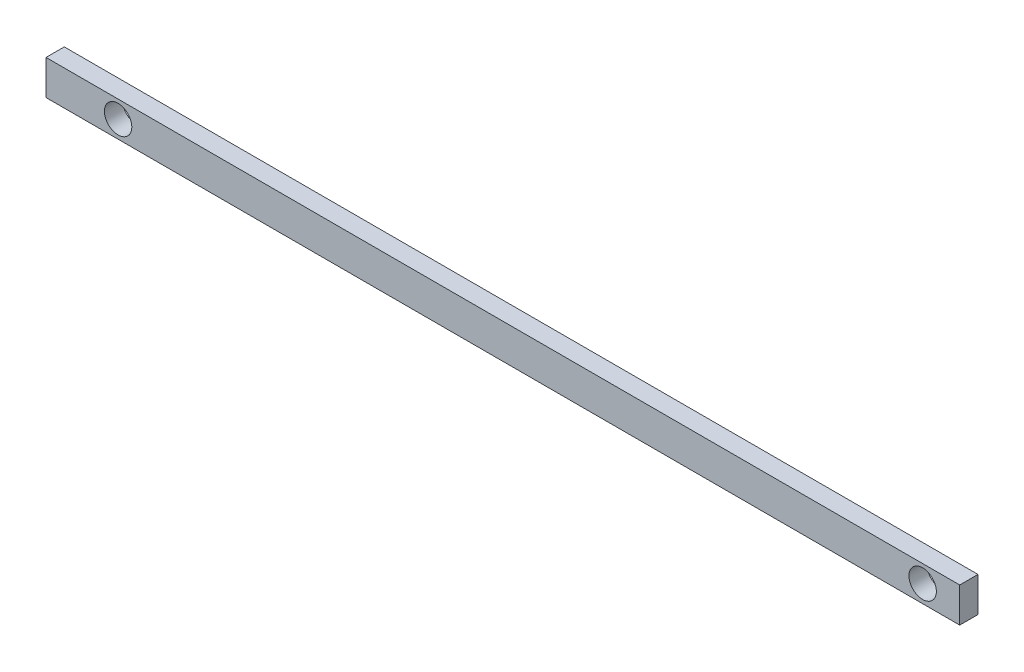
ISO-10303-21;
HEADER;
FILE_DESCRIPTION(('STEP AP214'),'2;1');
FILE_NAME('part.step','',(''),(''),'','','');
FILE_SCHEMA(('AUTOMOTIVE_DESIGN { 1 0 10303 214 1 1 1 1 }'));
ENDSEC;
DATA;
#1=APPLICATION_CONTEXT('core data for automotive mechanical design processes');
#2=APPLICATION_PROTOCOL_DEFINITION('international standard','automotive_design',2000,#1);
#3=PRODUCT_CONTEXT('',#1,'mechanical');
#4=PRODUCT('Part','Part','',(#3));
#5=PRODUCT_RELATED_PRODUCT_CATEGORY('part','',(#4));
#6=PRODUCT_DEFINITION_FORMATION('','',#4);
#7=PRODUCT_DEFINITION_CONTEXT('part definition',#1,'design');
#8=PRODUCT_DEFINITION('design','',#6,#7);
#9=PRODUCT_DEFINITION_SHAPE('','',#8);
#10=(LENGTH_UNIT() NAMED_UNIT(*) SI_UNIT(.MILLI.,.METRE.));
#11=(NAMED_UNIT(*) PLANE_ANGLE_UNIT() SI_UNIT($,.RADIAN.));
#12=(NAMED_UNIT(*) SI_UNIT($,.STERADIAN.) SOLID_ANGLE_UNIT());
#13=UNCERTAINTY_MEASURE_WITH_UNIT(LENGTH_MEASURE(1.E-05),#10,'distance_accuracy_value','');
#14=(GEOMETRIC_REPRESENTATION_CONTEXT(3) GLOBAL_UNCERTAINTY_ASSIGNED_CONTEXT((#13)) GLOBAL_UNIT_ASSIGNED_CONTEXT((#10,
#11,#12)) REPRESENTATION_CONTEXT('',''));
#15=CARTESIAN_POINT('',(0.,0.,0.));
#16=DIRECTION('',(0.,0.,1.));
#17=DIRECTION('',(1.,0.,0.));
#18=AXIS2_PLACEMENT_3D('',#15,#16,#17);
#19=CARTESIAN_POINT('',(0.,0.,10.));
#20=DIRECTION('',(0.,0.,1.));
#21=DIRECTION('',(1.,0.,0.));
#22=AXIS2_PLACEMENT_3D('',#19,#20,#21);
#23=PLANE('',#22);
#24=CARTESIAN_POINT('',(-210.549507460908,0.,10.));
#25=DIRECTION('',(0.,0.,1.));
#26=DIRECTION('',(1.,0.,0.));
#27=AXIS2_PLACEMENT_3D('',#24,#25,#26);
#28=CIRCLE('',#27,7.50000000000001);
#29=CARTESIAN_POINT('',(-203.049507460908,0.,10.));
#30=VERTEX_POINT('',#29);
#31=EDGE_CURVE('E112',#30,#30,#28,.T.);
#32=ORIENTED_EDGE('',*,*,#31,.F.);
#33=EDGE_LOOP('',(#32));
#34=FACE_BOUND('',#33,.T.);
#35=DIRECTION('',(0.,1.,0.));
#36=VECTOR('',#35,1.);
#37=CARTESIAN_POINT('',(250.,9.51776649746193,10.));
#38=LINE('',#37,#36);
#39=CARTESIAN_POINT('',(250.,-9.51776649746193,10.));
#40=VERTEX_POINT('',#39);
#41=CARTESIAN_POINT('',(250.,9.51776649746193,10.));
#42=VERTEX_POINT('',#41);
#43=EDGE_CURVE('E92',#40,#42,#38,.T.);
#44=ORIENTED_EDGE('',*,*,#43,.T.);
#45=DIRECTION('',(-1.,0.,0.));
#46=VECTOR('',#45,1.);
#47=CARTESIAN_POINT('',(-250.,9.51776649746193,10.));
#48=LINE('',#47,#46);
#49=CARTESIAN_POINT('',(-250.,9.51776649746193,10.));
#50=VERTEX_POINT('',#49);
#51=EDGE_CURVE('E87',#42,#50,#48,.T.);
#52=ORIENTED_EDGE('',*,*,#51,.T.);
#53=DIRECTION('',(0.,-1.,0.));
#54=VECTOR('',#53,1.);
#55=CARTESIAN_POINT('',(-250.,9.51776649746193,10.));
#56=LINE('',#55,#54);
#57=CARTESIAN_POINT('',(-250.,-9.51776649746193,10.));
#58=VERTEX_POINT('',#57);
#59=EDGE_CURVE('E90',#50,#58,#56,.T.);
#60=ORIENTED_EDGE('',*,*,#59,.T.);
#61=DIRECTION('',(1.,0.,0.));
#62=VECTOR('',#61,1.);
#63=CARTESIAN_POINT('',(-250.,-9.51776649746193,10.));
#64=LINE('',#63,#62);
#65=EDGE_CURVE('E57',#58,#40,#64,.T.);
#66=ORIENTED_EDGE('',*,*,#65,.T.);
#67=EDGE_LOOP('',(#44,#52,#60,#66));
#68=FACE_BOUND('',#67,.T.);
#69=CARTESIAN_POINT('',(229.708492539092,0.,10.));
#70=DIRECTION('',(0.,0.,1.));
#71=DIRECTION('',(1.,0.,0.));
#72=AXIS2_PLACEMENT_3D('',#69,#70,#71);
#73=CIRCLE('',#72,7.50000000000001);
#74=CARTESIAN_POINT('',(237.208492539092,0.,10.));
#75=VERTEX_POINT('',#74);
#76=EDGE_CURVE('E134',#75,#75,#73,.T.);
#77=ORIENTED_EDGE('',*,*,#76,.F.);
#78=EDGE_LOOP('',(#77));
#79=FACE_BOUND('',#78,.T.);
#80=ADVANCED_FACE('F39',(#34,#68,#79),#23,.T.);
#81=CARTESIAN_POINT('',(0.,0.,0.));
#82=DIRECTION('',(0.,0.,1.));
#83=DIRECTION('',(1.,0.,0.));
#84=AXIS2_PLACEMENT_3D('',#81,#82,#83);
#85=PLANE('',#84);
#86=DIRECTION('',(0.,1.,0.));
#87=VECTOR('',#86,1.);
#88=CARTESIAN_POINT('',(250.,9.51776649746193,0.));
#89=LINE('',#88,#87);
#90=CARTESIAN_POINT('',(250.,-9.51776649746193,0.));
#91=VERTEX_POINT('',#90);
#92=CARTESIAN_POINT('',(250.,9.51776649746193,0.));
#93=VERTEX_POINT('',#92);
#94=EDGE_CURVE('E108',#91,#93,#89,.T.);
#95=ORIENTED_EDGE('',*,*,#94,.F.);
#96=DIRECTION('',(1.,0.,0.));
#97=VECTOR('',#96,1.);
#98=CARTESIAN_POINT('',(-250.,-9.51776649746193,0.));
#99=LINE('',#98,#97);
#100=CARTESIAN_POINT('',(-250.,-9.51776649746193,0.));
#101=VERTEX_POINT('',#100);
#102=EDGE_CURVE('E80',#101,#91,#99,.T.);
#103=ORIENTED_EDGE('',*,*,#102,.F.);
#104=DIRECTION('',(0.,-1.,0.));
#105=VECTOR('',#104,1.);
#106=CARTESIAN_POINT('',(-250.,9.51776649746193,0.));
#107=LINE('',#106,#105);
#108=CARTESIAN_POINT('',(-250.,9.51776649746193,0.));
#109=VERTEX_POINT('',#108);
#110=EDGE_CURVE('E74',#109,#101,#107,.T.);
#111=ORIENTED_EDGE('',*,*,#110,.F.);
#112=DIRECTION('',(-1.,0.,0.));
#113=VECTOR('',#112,1.);
#114=CARTESIAN_POINT('',(-250.,9.51776649746193,0.));
#115=LINE('',#114,#113);
#116=EDGE_CURVE('E97',#93,#109,#115,.T.);
#117=ORIENTED_EDGE('',*,*,#116,.F.);
#118=EDGE_LOOP('',(#95,#103,#111,#117));
#119=FACE_BOUND('',#118,.T.);
#120=CARTESIAN_POINT('',(-210.549507460908,0.,0.));
#121=DIRECTION('',(0.,0.,1.));
#122=DIRECTION('',(1.,0.,0.));
#123=AXIS2_PLACEMENT_3D('',#120,#121,#122);
#124=CIRCLE('',#123,7.50000000000001);
#125=CARTESIAN_POINT('',(-203.049507460908,0.,0.));
#126=VERTEX_POINT('',#125);
#127=EDGE_CURVE('E130',#126,#126,#124,.T.);
#128=ORIENTED_EDGE('',*,*,#127,.T.);
#129=EDGE_LOOP('',(#128));
#130=FACE_BOUND('',#129,.T.);
#131=CARTESIAN_POINT('',(229.708492539092,0.,0.));
#132=DIRECTION('',(0.,0.,1.));
#133=DIRECTION('',(1.,0.,0.));
#134=AXIS2_PLACEMENT_3D('',#131,#132,#133);
#135=CIRCLE('',#134,7.50000000000001);
#136=CARTESIAN_POINT('',(237.208492539092,0.,0.));
#137=VERTEX_POINT('',#136);
#138=EDGE_CURVE('E138',#137,#137,#135,.T.);
#139=ORIENTED_EDGE('',*,*,#138,.T.);
#140=EDGE_LOOP('',(#139));
#141=FACE_BOUND('',#140,.T.);
#142=ADVANCED_FACE('F125',(#119,#130,#141),#85,.F.);
#143=CARTESIAN_POINT('',(250.,9.51776649746193,10.));
#144=DIRECTION('',(-1.,0.,0.));
#145=DIRECTION('',(0.,0.,1.));
#146=AXIS2_PLACEMENT_3D('',#143,#144,#145);
#147=PLANE('',#146);
#148=ORIENTED_EDGE('',*,*,#94,.T.);
#149=DIRECTION('',(0.,0.,-1.));
#150=VECTOR('',#149,1.);
#151=CARTESIAN_POINT('',(250.,9.51776649746193,10.));
#152=LINE('',#151,#150);
#153=EDGE_CURVE('E11',#42,#93,#152,.T.);
#154=ORIENTED_EDGE('',*,*,#153,.F.);
#155=ORIENTED_EDGE('',*,*,#43,.F.);
#156=DIRECTION('',(0.,0.,-1.));
#157=VECTOR('',#156,1.);
#158=CARTESIAN_POINT('',(250.,-9.51776649746193,10.));
#159=LINE('',#158,#157);
#160=EDGE_CURVE('E104',#40,#91,#159,.T.);
#161=ORIENTED_EDGE('',*,*,#160,.T.);
#162=EDGE_LOOP('',(#148,#154,#155,#161));
#163=FACE_BOUND('',#162,.T.);
#164=ADVANCED_FACE('F41',(#163),#147,.F.);
#165=CARTESIAN_POINT('',(-250.,9.51776649746193,10.));
#166=DIRECTION('',(0.,-1.,0.));
#167=DIRECTION('',(0.,0.,-1.));
#168=AXIS2_PLACEMENT_3D('',#165,#166,#167);
#169=PLANE('',#168);
#170=ORIENTED_EDGE('',*,*,#116,.T.);
#171=DIRECTION('',(0.,0.,-1.));
#172=VECTOR('',#171,1.);
#173=CARTESIAN_POINT('',(-250.,9.51776649746193,10.));
#174=LINE('',#173,#172);
#175=EDGE_CURVE('E49',#50,#109,#174,.T.);
#176=ORIENTED_EDGE('',*,*,#175,.F.);
#177=ORIENTED_EDGE('',*,*,#51,.F.);
#178=ORIENTED_EDGE('',*,*,#153,.T.);
#179=EDGE_LOOP('',(#170,#176,#177,#178));
#180=FACE_BOUND('',#179,.T.);
#181=ADVANCED_FACE('F96',(#180),#169,.F.);
#182=CARTESIAN_POINT('',(-250.,9.51776649746193,10.));
#183=DIRECTION('',(1.,0.,0.));
#184=DIRECTION('',(0.,0.,-1.));
#185=AXIS2_PLACEMENT_3D('',#182,#183,#184);
#186=PLANE('',#185);
#187=ORIENTED_EDGE('',*,*,#110,.T.);
#188=DIRECTION('',(0.,0.,-1.));
#189=VECTOR('',#188,1.);
#190=CARTESIAN_POINT('',(-250.,-9.51776649746193,10.));
#191=LINE('',#190,#189);
#192=EDGE_CURVE('E99',#58,#101,#191,.T.);
#193=ORIENTED_EDGE('',*,*,#192,.F.);
#194=ORIENTED_EDGE('',*,*,#59,.F.);
#195=ORIENTED_EDGE('',*,*,#175,.T.);
#196=EDGE_LOOP('',(#187,#193,#194,#195));
#197=FACE_BOUND('',#196,.T.);
#198=ADVANCED_FACE('F100',(#197),#186,.F.);
#199=CARTESIAN_POINT('',(-250.,-9.51776649746193,10.));
#200=DIRECTION('',(0.,1.,0.));
#201=DIRECTION('',(0.,0.,1.));
#202=AXIS2_PLACEMENT_3D('',#199,#200,#201);
#203=PLANE('',#202);
#204=ORIENTED_EDGE('',*,*,#102,.T.);
#205=ORIENTED_EDGE('',*,*,#160,.F.);
#206=ORIENTED_EDGE('',*,*,#65,.F.);
#207=ORIENTED_EDGE('',*,*,#192,.T.);
#208=EDGE_LOOP('',(#204,#205,#206,#207));
#209=FACE_BOUND('',#208,.T.);
#210=ADVANCED_FACE('F122',(#209),#203,.F.);
#211=CARTESIAN_POINT('',(-210.549507460908,0.,10.));
#212=DIRECTION('',(0.,0.,-1.));
#213=DIRECTION('',(-1.,0.,0.));
#214=AXIS2_PLACEMENT_3D('',#211,#212,#213);
#215=CYLINDRICAL_SURFACE('',#214,7.50000000000001);
#216=ORIENTED_EDGE('',*,*,#31,.T.);
#217=EDGE_LOOP('',(#216));
#218=FACE_BOUND('',#217,.T.);
#219=ORIENTED_EDGE('',*,*,#127,.F.);
#220=EDGE_LOOP('',(#219));
#221=FACE_BOUND('',#220,.T.);
#222=ADVANCED_FACE('F157',(#218,#221),#215,.F.);
#223=CARTESIAN_POINT('',(229.708492539092,0.,10.));
#224=DIRECTION('',(0.,0.,-1.));
#225=DIRECTION('',(-1.,0.,0.));
#226=AXIS2_PLACEMENT_3D('',#223,#224,#225);
#227=CYLINDRICAL_SURFACE('',#226,7.50000000000001);
#228=ORIENTED_EDGE('',*,*,#76,.T.);
#229=EDGE_LOOP('',(#228));
#230=FACE_BOUND('',#229,.T.);
#231=ORIENTED_EDGE('',*,*,#138,.F.);
#232=EDGE_LOOP('',(#231));
#233=FACE_BOUND('',#232,.T.);
#234=ADVANCED_FACE('F146',(#230,#233),#227,.F.);
#235=CLOSED_SHELL('',(#80,#142,#164,#181,#198,#210,#222,#234));
#236=MANIFOLD_SOLID_BREP('B2',#235);
#237=ADVANCED_BREP_SHAPE_REPRESENTATION('',(#18,#236),#14);
#238=SHAPE_DEFINITION_REPRESENTATION(#9,#237);
ENDSEC;
END-ISO-10303-21;
